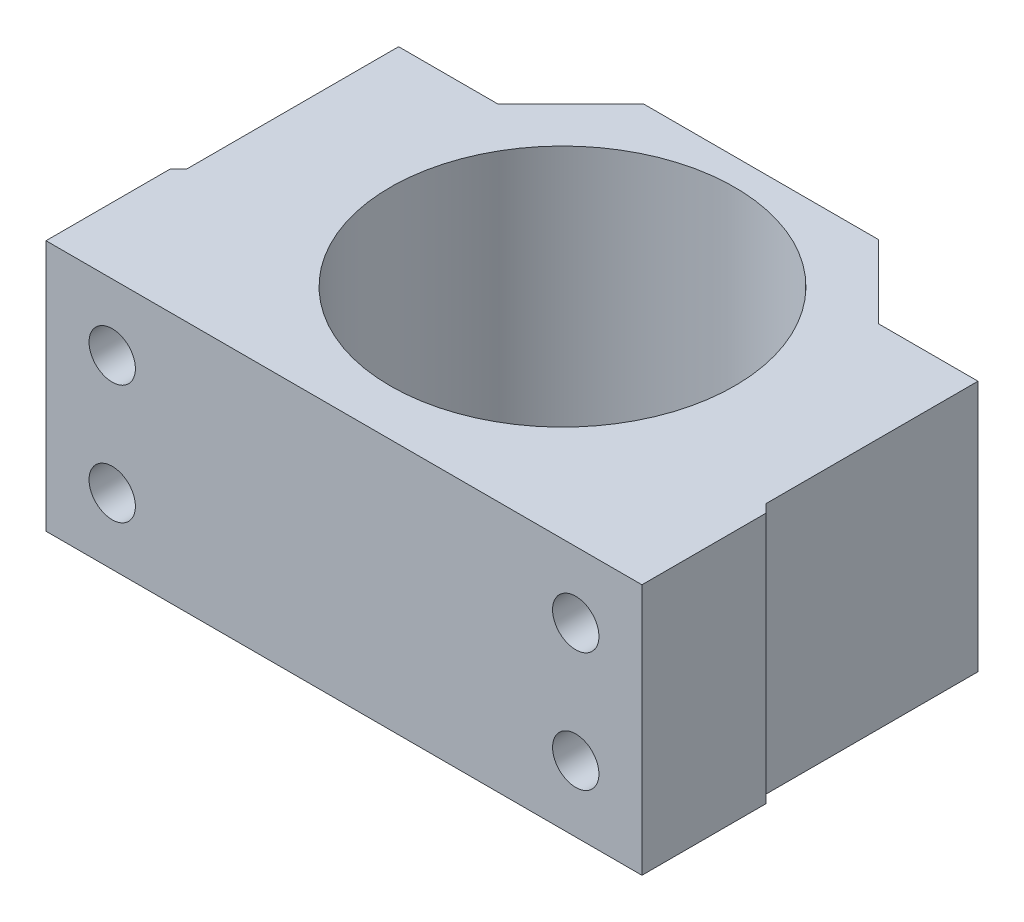
ISO-10303-21;
HEADER;
FILE_DESCRIPTION(('STEP AP214'),'2;1');
FILE_NAME('part.step','',(''),(''),'','','');
FILE_SCHEMA(('AUTOMOTIVE_DESIGN { 1 0 10303 214 1 1 1 1 }'));
ENDSEC;
DATA;
#1=APPLICATION_CONTEXT('core data for automotive mechanical design processes');
#2=APPLICATION_PROTOCOL_DEFINITION('international standard','automotive_design',2000,#1);
#3=PRODUCT_CONTEXT('',#1,'mechanical');
#4=PRODUCT('Part','Part','',(#3));
#5=PRODUCT_RELATED_PRODUCT_CATEGORY('part','',(#4));
#6=PRODUCT_DEFINITION_FORMATION('','',#4);
#7=PRODUCT_DEFINITION_CONTEXT('part definition',#1,'design');
#8=PRODUCT_DEFINITION('design','',#6,#7);
#9=PRODUCT_DEFINITION_SHAPE('','',#8);
#10=(LENGTH_UNIT() NAMED_UNIT(*) SI_UNIT(.MILLI.,.METRE.));
#11=(NAMED_UNIT(*) PLANE_ANGLE_UNIT() SI_UNIT($,.RADIAN.));
#12=(NAMED_UNIT(*) SI_UNIT($,.STERADIAN.) SOLID_ANGLE_UNIT());
#13=UNCERTAINTY_MEASURE_WITH_UNIT(LENGTH_MEASURE(1.E-05),#10,'distance_accuracy_value','');
#14=(GEOMETRIC_REPRESENTATION_CONTEXT(3) GLOBAL_UNCERTAINTY_ASSIGNED_CONTEXT((#13)) GLOBAL_UNIT_ASSIGNED_CONTEXT((#10,
#11,#12)) REPRESENTATION_CONTEXT('',''));
#15=CARTESIAN_POINT('',(0.,0.,0.));
#16=DIRECTION('',(0.,0.,1.));
#17=DIRECTION('',(1.,0.,0.));
#18=AXIS2_PLACEMENT_3D('',#15,#16,#17);
#19=CARTESIAN_POINT('',(90.,38.,0.));
#20=DIRECTION('',(1.,0.,0.));
#21=DIRECTION('',(0.,0.,-1.));
#22=AXIS2_PLACEMENT_3D('',#19,#20,#21);
#23=PLANE('',#22);
#24=DIRECTION('',(0.,0.,1.));
#25=VECTOR('',#24,1.);
#26=CARTESIAN_POINT('',(90.,0.,0.));
#27=LINE('',#26,#25);
#28=CARTESIAN_POINT('',(90.,0.,-18.75));
#29=VERTEX_POINT('',#28);
#30=CARTESIAN_POINT('',(90.,0.,0.));
#31=VERTEX_POINT('',#30);
#32=EDGE_CURVE('E184',#29,#31,#27,.T.);
#33=ORIENTED_EDGE('',*,*,#32,.F.);
#34=DIRECTION('',(0.,-1.,0.));
#35=VECTOR('',#34,1.);
#36=CARTESIAN_POINT('',(90.,38.,-18.75));
#37=LINE('',#36,#35);
#38=CARTESIAN_POINT('',(90.,38.,-18.75));
#39=VERTEX_POINT('',#38);
#40=EDGE_CURVE('E11',#39,#29,#37,.T.);
#41=ORIENTED_EDGE('',*,*,#40,.F.);
#42=DIRECTION('',(0.,0.,1.));
#43=VECTOR('',#42,1.);
#44=CARTESIAN_POINT('',(90.,38.,0.));
#45=LINE('',#44,#43);
#46=CARTESIAN_POINT('',(90.,38.,0.));
#47=VERTEX_POINT('',#46);
#48=EDGE_CURVE('E310',#39,#47,#45,.T.);
#49=ORIENTED_EDGE('',*,*,#48,.T.);
#50=DIRECTION('',(0.,-1.,0.));
#51=VECTOR('',#50,1.);
#52=CARTESIAN_POINT('',(90.,38.,0.));
#53=LINE('',#52,#51);
#54=EDGE_CURVE('E99',#47,#31,#53,.T.);
#55=ORIENTED_EDGE('',*,*,#54,.T.);
#56=EDGE_LOOP('',(#33,#41,#49,#55));
#57=FACE_BOUND('',#56,.T.);
#58=ADVANCED_FACE('F36',(#57),#23,.T.);
#59=CARTESIAN_POINT('',(54.3749999999993,38.,-54.3750000000002));
#60=DIRECTION('',(0.707106781186542,0.,-0.707106781186553));
#61=DIRECTION('',(-0.707106781186553,0.,-0.707106781186542));
#62=AXIS2_PLACEMENT_3D('',#59,#60,#61);
#63=PLANE('',#62);
#64=DIRECTION('',(0.707106781186553,0.,0.707106781186542));
#65=VECTOR('',#64,1.);
#66=CARTESIAN_POINT('',(54.3749999999993,0.,-54.3750000000002));
#67=LINE('',#66,#65);
#68=CARTESIAN_POINT('',(88.75,0.,-20.));
#69=VERTEX_POINT('',#68);
#70=EDGE_CURVE('E182',#69,#29,#67,.T.);
#71=ORIENTED_EDGE('',*,*,#70,.F.);
#72=DIRECTION('',(0.,-1.,0.));
#73=VECTOR('',#72,1.);
#74=CARTESIAN_POINT('',(88.75,38.,-20.));
#75=LINE('',#74,#73);
#76=CARTESIAN_POINT('',(88.75,38.,-20.));
#77=VERTEX_POINT('',#76);
#78=EDGE_CURVE('E45',#77,#69,#75,.T.);
#79=ORIENTED_EDGE('',*,*,#78,.F.);
#80=DIRECTION('',(0.707106781186553,0.,0.707106781186542));
#81=VECTOR('',#80,1.);
#82=CARTESIAN_POINT('',(54.3749999999993,38.,-54.3750000000002));
#83=LINE('',#82,#81);
#84=EDGE_CURVE('E312',#77,#39,#83,.T.);
#85=ORIENTED_EDGE('',*,*,#84,.T.);
#86=ORIENTED_EDGE('',*,*,#40,.T.);
#87=EDGE_LOOP('',(#71,#79,#85,#86));
#88=FACE_BOUND('',#87,.T.);
#89=ADVANCED_FACE('F183',(#88),#63,.T.);
#90=CARTESIAN_POINT('',(88.75,38.,0.));
#91=DIRECTION('',(1.,0.,0.));
#92=DIRECTION('',(0.,0.,-1.));
#93=AXIS2_PLACEMENT_3D('',#90,#91,#92);
#94=PLANE('',#93);
#95=DIRECTION('',(0.,0.,1.));
#96=VECTOR('',#95,1.);
#97=CARTESIAN_POINT('',(88.75,0.,0.));
#98=LINE('',#97,#96);
#99=CARTESIAN_POINT('',(88.75,0.,-52.));
#100=VERTEX_POINT('',#99);
#101=EDGE_CURVE('E175',#100,#69,#98,.T.);
#102=ORIENTED_EDGE('',*,*,#101,.F.);
#103=DIRECTION('',(0.,-1.,0.));
#104=VECTOR('',#103,1.);
#105=CARTESIAN_POINT('',(88.75,38.,-52.));
#106=LINE('',#105,#104);
#107=CARTESIAN_POINT('',(88.75,38.,-52.));
#108=VERTEX_POINT('',#107);
#109=EDGE_CURVE('E168',#108,#100,#106,.T.);
#110=ORIENTED_EDGE('',*,*,#109,.F.);
#111=DIRECTION('',(0.,0.,1.));
#112=VECTOR('',#111,1.);
#113=CARTESIAN_POINT('',(88.75,38.,0.));
#114=LINE('',#113,#112);
#115=EDGE_CURVE('E177',#108,#77,#114,.T.);
#116=ORIENTED_EDGE('',*,*,#115,.T.);
#117=ORIENTED_EDGE('',*,*,#78,.T.);
#118=EDGE_LOOP('',(#102,#110,#116,#117));
#119=FACE_BOUND('',#118,.T.);
#120=ADVANCED_FACE('F173',(#119),#94,.T.);
#121=CARTESIAN_POINT('',(5.77315972805093E-13,38.,-52.000000000001));
#122=DIRECTION('',(0.,0.,1.));
#123=DIRECTION('',(1.,0.,0.));
#124=AXIS2_PLACEMENT_3D('',#121,#122,#123);
#125=PLANE('',#124);
#126=CARTESIAN_POINT('',(80.,10.,-52.0000000000001));
#127=DIRECTION('',(0.,0.,1.));
#128=DIRECTION('',(1.,0.,0.));
#129=AXIS2_PLACEMENT_3D('',#126,#127,#128);
#130=CIRCLE('',#129,3.50000000000001);
#131=CARTESIAN_POINT('',(83.5,10.,-52.));
#132=VERTEX_POINT('',#131);
#133=EDGE_CURVE('E287',#132,#132,#130,.T.);
#134=ORIENTED_EDGE('',*,*,#133,.T.);
#135=EDGE_LOOP('',(#134));
#136=FACE_BOUND('',#135,.T.);
#137=CARTESIAN_POINT('',(80.,28.,-52.0000000000001));
#138=DIRECTION('',(0.,0.,1.));
#139=DIRECTION('',(1.,0.,0.));
#140=AXIS2_PLACEMENT_3D('',#137,#138,#139);
#141=CIRCLE('',#140,3.50000000000001);
#142=CARTESIAN_POINT('',(83.5,28.,-52.));
#143=VERTEX_POINT('',#142);
#144=EDGE_CURVE('E291',#143,#143,#141,.T.);
#145=ORIENTED_EDGE('',*,*,#144,.T.);
#146=EDGE_LOOP('',(#145));
#147=FACE_BOUND('',#146,.T.);
#148=DIRECTION('',(-1.,0.,0.));
#149=VECTOR('',#148,1.);
#150=CARTESIAN_POINT('',(5.77315972805093E-13,0.,-52.000000000001));
#151=LINE('',#150,#149);
#152=CARTESIAN_POINT('',(73.75,0.,-52.0000000000002));
#153=VERTEX_POINT('',#152);
#154=EDGE_CURVE('E189',#100,#153,#151,.T.);
#155=ORIENTED_EDGE('',*,*,#154,.T.);
#156=DIRECTION('',(0.,-1.,0.));
#157=VECTOR('',#156,1.);
#158=CARTESIAN_POINT('',(73.75,38.,-52.0000000000002));
#159=LINE('',#158,#157);
#160=CARTESIAN_POINT('',(73.75,38.,-52.0000000000002));
#161=VERTEX_POINT('',#160);
#162=EDGE_CURVE('E165',#161,#153,#159,.T.);
#163=ORIENTED_EDGE('',*,*,#162,.F.);
#164=DIRECTION('',(-1.,0.,0.));
#165=VECTOR('',#164,1.);
#166=CARTESIAN_POINT('',(5.77315972805093E-13,38.,-52.000000000001));
#167=LINE('',#166,#165);
#168=EDGE_CURVE('E315',#108,#161,#167,.T.);
#169=ORIENTED_EDGE('',*,*,#168,.F.);
#170=ORIENTED_EDGE('',*,*,#109,.T.);
#171=EDGE_LOOP('',(#155,#163,#169,#170));
#172=FACE_BOUND('',#171,.T.);
#173=ADVANCED_FACE('F226',(#136,#147,#172),#125,.F.);
#174=CARTESIAN_POINT('',(62.874999999999,38.,-62.8750000000008));
#175=DIRECTION('',(-0.707106781186537,0.,0.707106781186558));
#176=DIRECTION('',(0.707106781186558,0.,0.707106781186537));
#177=AXIS2_PLACEMENT_3D('',#174,#175,#176);
#178=PLANE('',#177);
#179=DIRECTION('',(-0.707106781186558,0.,-0.707106781186537));
#180=VECTOR('',#179,1.);
#181=CARTESIAN_POINT('',(62.874999999999,0.,-62.8750000000008));
#182=LINE('',#181,#180);
#183=CARTESIAN_POINT('',(62.7399999999999,0.,-63.01));
#184=VERTEX_POINT('',#183);
#185=EDGE_CURVE('E191',#153,#184,#182,.T.);
#186=ORIENTED_EDGE('',*,*,#185,.T.);
#187=DIRECTION('',(0.,-1.,0.));
#188=VECTOR('',#187,1.);
#189=CARTESIAN_POINT('',(62.7399999999999,38.,-63.01));
#190=LINE('',#189,#188);
#191=CARTESIAN_POINT('',(62.7399999999999,38.,-63.01));
#192=VERTEX_POINT('',#191);
#193=EDGE_CURVE('E163',#192,#184,#190,.T.);
#194=ORIENTED_EDGE('',*,*,#193,.F.);
#195=DIRECTION('',(-0.707106781186558,0.,-0.707106781186537));
#196=VECTOR('',#195,1.);
#197=CARTESIAN_POINT('',(62.874999999999,38.,-62.8750000000008));
#198=LINE('',#197,#196);
#199=EDGE_CURVE('E318',#161,#192,#198,.T.);
#200=ORIENTED_EDGE('',*,*,#199,.F.);
#201=ORIENTED_EDGE('',*,*,#162,.T.);
#202=EDGE_LOOP('',(#186,#194,#200,#201));
#203=FACE_BOUND('',#202,.T.);
#204=ADVANCED_FACE('F229',(#203),#178,.F.);
#205=CARTESIAN_POINT('',(0.,38.,-63.01));
#206=DIRECTION('',(0.,0.,-1.));
#207=DIRECTION('',(-1.,0.,0.));
#208=AXIS2_PLACEMENT_3D('',#205,#206,#207);
#209=PLANE('',#208);
#210=DIRECTION('',(1.,0.,0.));
#211=VECTOR('',#210,1.);
#212=CARTESIAN_POINT('',(0.,0.,-63.01));
#213=LINE('',#212,#211);
#214=CARTESIAN_POINT('',(27.2599999999997,0.,-63.01));
#215=VERTEX_POINT('',#214);
#216=EDGE_CURVE('E197',#215,#184,#213,.T.);
#217=ORIENTED_EDGE('',*,*,#216,.F.);
#218=DIRECTION('',(0.,-1.,0.));
#219=VECTOR('',#218,1.);
#220=CARTESIAN_POINT('',(27.2599999999997,38.,-63.01));
#221=LINE('',#220,#219);
#222=CARTESIAN_POINT('',(27.2599999999997,38.,-63.01));
#223=VERTEX_POINT('',#222);
#224=EDGE_CURVE('E161',#223,#215,#221,.T.);
#225=ORIENTED_EDGE('',*,*,#224,.F.);
#226=DIRECTION('',(1.,0.,0.));
#227=VECTOR('',#226,1.);
#228=CARTESIAN_POINT('',(0.,38.,-63.01));
#229=LINE('',#228,#227);
#230=EDGE_CURVE('E320',#223,#192,#229,.T.);
#231=ORIENTED_EDGE('',*,*,#230,.T.);
#232=ORIENTED_EDGE('',*,*,#193,.T.);
#233=EDGE_LOOP('',(#217,#225,#231,#232));
#234=FACE_BOUND('',#233,.T.);
#235=ADVANCED_FACE('F233',(#234),#209,.T.);
#236=CARTESIAN_POINT('',(-17.8749999999998,38.,-17.8749999999992));
#237=DIRECTION('',(-0.707106781186558,0.,-0.707106781186537));
#238=DIRECTION('',(-0.707106781186537,0.,0.707106781186558));
#239=AXIS2_PLACEMENT_3D('',#236,#237,#238);
#240=PLANE('',#239);
#241=DIRECTION('',(0.707106781186537,0.,-0.707106781186558));
#242=VECTOR('',#241,1.);
#243=CARTESIAN_POINT('',(-17.8749999999998,0.,-17.8749999999992));
#244=LINE('',#243,#242);
#245=CARTESIAN_POINT('',(16.25,0.,-52.));
#246=VERTEX_POINT('',#245);
#247=EDGE_CURVE('E200',#246,#215,#244,.T.);
#248=ORIENTED_EDGE('',*,*,#247,.F.);
#249=DIRECTION('',(0.,-1.,0.));
#250=VECTOR('',#249,1.);
#251=CARTESIAN_POINT('',(16.25,38.,-52.));
#252=LINE('',#251,#250);
#253=CARTESIAN_POINT('',(16.25,38.,-52.));
#254=VERTEX_POINT('',#253);
#255=EDGE_CURVE('E159',#254,#246,#252,.T.);
#256=ORIENTED_EDGE('',*,*,#255,.F.);
#257=DIRECTION('',(0.707106781186537,0.,-0.707106781186558));
#258=VECTOR('',#257,1.);
#259=CARTESIAN_POINT('',(-17.8749999999998,38.,-17.8749999999992));
#260=LINE('',#259,#258);
#261=EDGE_CURVE('E323',#254,#223,#260,.T.);
#262=ORIENTED_EDGE('',*,*,#261,.T.);
#263=ORIENTED_EDGE('',*,*,#224,.T.);
#264=EDGE_LOOP('',(#248,#256,#262,#263));
#265=FACE_BOUND('',#264,.T.);
#266=ADVANCED_FACE('F237',(#265),#240,.T.);
#267=CARTESIAN_POINT('',(0.,38.,-52.));
#268=DIRECTION('',(0.,0.,-1.));
#269=DIRECTION('',(-1.,0.,0.));
#270=AXIS2_PLACEMENT_3D('',#267,#268,#269);
#271=PLANE('',#270);
#272=CARTESIAN_POINT('',(10.,10.,-52.));
#273=DIRECTION('',(0.,0.,-1.));
#274=DIRECTION('',(-1.,0.,0.));
#275=AXIS2_PLACEMENT_3D('',#272,#273,#274);
#276=CIRCLE('',#275,3.5);
#277=CARTESIAN_POINT('',(6.5,10.,-52.));
#278=VERTEX_POINT('',#277);
#279=EDGE_CURVE('E300',#278,#278,#276,.T.);
#280=ORIENTED_EDGE('',*,*,#279,.F.);
#281=EDGE_LOOP('',(#280));
#282=FACE_BOUND('',#281,.T.);
#283=CARTESIAN_POINT('',(10.,28.,-52.));
#284=DIRECTION('',(0.,0.,-1.));
#285=DIRECTION('',(-1.,0.,0.));
#286=AXIS2_PLACEMENT_3D('',#283,#284,#285);
#287=CIRCLE('',#286,3.5);
#288=CARTESIAN_POINT('',(6.5,28.,-52.));
#289=VERTEX_POINT('',#288);
#290=EDGE_CURVE('E217',#289,#289,#287,.T.);
#291=ORIENTED_EDGE('',*,*,#290,.F.);
#292=EDGE_LOOP('',(#291));
#293=FACE_BOUND('',#292,.T.);
#294=DIRECTION('',(1.,0.,0.));
#295=VECTOR('',#294,1.);
#296=CARTESIAN_POINT('',(0.,0.,-52.));
#297=LINE('',#296,#295);
#298=CARTESIAN_POINT('',(1.25,0.,-52.));
#299=VERTEX_POINT('',#298);
#300=EDGE_CURVE('E203',#299,#246,#297,.T.);
#301=ORIENTED_EDGE('',*,*,#300,.F.);
#302=DIRECTION('',(0.,-1.,0.));
#303=VECTOR('',#302,1.);
#304=CARTESIAN_POINT('',(1.25,38.,-52.));
#305=LINE('',#304,#303);
#306=CARTESIAN_POINT('',(1.25,38.,-52.));
#307=VERTEX_POINT('',#306);
#308=EDGE_CURVE('E153',#307,#299,#305,.T.);
#309=ORIENTED_EDGE('',*,*,#308,.F.);
#310=DIRECTION('',(1.,0.,0.));
#311=VECTOR('',#310,1.);
#312=CARTESIAN_POINT('',(0.,38.,-52.));
#313=LINE('',#312,#311);
#314=EDGE_CURVE('E326',#307,#254,#313,.T.);
#315=ORIENTED_EDGE('',*,*,#314,.T.);
#316=ORIENTED_EDGE('',*,*,#255,.T.);
#317=EDGE_LOOP('',(#301,#309,#315,#316));
#318=FACE_BOUND('',#317,.T.);
#319=ADVANCED_FACE('F241',(#282,#293,#318),#271,.T.);
#320=CARTESIAN_POINT('',(1.25,38.,0.));
#321=DIRECTION('',(1.,0.,0.));
#322=DIRECTION('',(0.,0.,-1.));
#323=AXIS2_PLACEMENT_3D('',#320,#321,#322);
#324=PLANE('',#323);
#325=DIRECTION('',(0.,0.,1.));
#326=VECTOR('',#325,1.);
#327=CARTESIAN_POINT('',(1.25,0.,0.));
#328=LINE('',#327,#326);
#329=CARTESIAN_POINT('',(1.25,0.,-20.));
#330=VERTEX_POINT('',#329);
#331=EDGE_CURVE('E206',#299,#330,#328,.T.);
#332=ORIENTED_EDGE('',*,*,#331,.T.);
#333=DIRECTION('',(0.,-1.,0.));
#334=VECTOR('',#333,1.);
#335=CARTESIAN_POINT('',(1.25,38.,-20.));
#336=LINE('',#335,#334);
#337=CARTESIAN_POINT('',(1.25,38.,-20.));
#338=VERTEX_POINT('',#337);
#339=EDGE_CURVE('E151',#338,#330,#336,.T.);
#340=ORIENTED_EDGE('',*,*,#339,.F.);
#341=DIRECTION('',(0.,0.,1.));
#342=VECTOR('',#341,1.);
#343=CARTESIAN_POINT('',(1.25,38.,0.));
#344=LINE('',#343,#342);
#345=EDGE_CURVE('E144',#307,#338,#344,.T.);
#346=ORIENTED_EDGE('',*,*,#345,.F.);
#347=ORIENTED_EDGE('',*,*,#308,.T.);
#348=EDGE_LOOP('',(#332,#340,#346,#347));
#349=FACE_BOUND('',#348,.T.);
#350=ADVANCED_FACE('F245',(#349),#324,.F.);
#351=CARTESIAN_POINT('',(-9.37499999999999,38.,-9.37499999999989));
#352=DIRECTION('',(0.707106781186552,0.,0.707106781186544));
#353=DIRECTION('',(0.707106781186544,0.,-0.707106781186552));
#354=AXIS2_PLACEMENT_3D('',#351,#352,#353);
#355=PLANE('',#354);
#356=DIRECTION('',(-0.707106781186544,0.,0.707106781186552));
#357=VECTOR('',#356,1.);
#358=CARTESIAN_POINT('',(-9.37499999999999,0.,-9.37499999999989));
#359=LINE('',#358,#357);
#360=CARTESIAN_POINT('',(0.,0.,-18.75));
#361=VERTEX_POINT('',#360);
#362=EDGE_CURVE('E150',#330,#361,#359,.T.);
#363=ORIENTED_EDGE('',*,*,#362,.T.);
#364=DIRECTION('',(0.,-1.,0.));
#365=VECTOR('',#364,1.);
#366=CARTESIAN_POINT('',(0.,38.,-18.75));
#367=LINE('',#366,#365);
#368=CARTESIAN_POINT('',(0.,38.,-18.75));
#369=VERTEX_POINT('',#368);
#370=EDGE_CURVE('E135',#369,#361,#367,.T.);
#371=ORIENTED_EDGE('',*,*,#370,.F.);
#372=DIRECTION('',(-0.707106781186544,0.,0.707106781186552));
#373=VECTOR('',#372,1.);
#374=CARTESIAN_POINT('',(-9.37499999999999,38.,-9.37499999999989));
#375=LINE('',#374,#373);
#376=EDGE_CURVE('E138',#338,#369,#375,.T.);
#377=ORIENTED_EDGE('',*,*,#376,.F.);
#378=ORIENTED_EDGE('',*,*,#339,.T.);
#379=EDGE_LOOP('',(#363,#371,#377,#378));
#380=FACE_BOUND('',#379,.T.);
#381=ADVANCED_FACE('F149',(#380),#355,.F.);
#382=CARTESIAN_POINT('',(0.,38.,0.));
#383=DIRECTION('',(1.,0.,0.));
#384=DIRECTION('',(0.,0.,-1.));
#385=AXIS2_PLACEMENT_3D('',#382,#383,#384);
#386=PLANE('',#385);
#387=DIRECTION('',(0.,0.,1.));
#388=VECTOR('',#387,1.);
#389=CARTESIAN_POINT('',(0.,0.,0.));
#390=LINE('',#389,#388);
#391=CARTESIAN_POINT('',(0.,0.,0.));
#392=VERTEX_POINT('',#391);
#393=EDGE_CURVE('E210',#361,#392,#390,.T.);
#394=ORIENTED_EDGE('',*,*,#393,.T.);
#395=DIRECTION('',(0.,-1.,0.));
#396=VECTOR('',#395,1.);
#397=CARTESIAN_POINT('',(0.,38.,0.));
#398=LINE('',#397,#396);
#399=CARTESIAN_POINT('',(0.,38.,0.));
#400=VERTEX_POINT('',#399);
#401=EDGE_CURVE('E137',#400,#392,#398,.T.);
#402=ORIENTED_EDGE('',*,*,#401,.F.);
#403=DIRECTION('',(0.,0.,1.));
#404=VECTOR('',#403,1.);
#405=CARTESIAN_POINT('',(0.,38.,0.));
#406=LINE('',#405,#404);
#407=EDGE_CURVE('E130',#369,#400,#406,.T.);
#408=ORIENTED_EDGE('',*,*,#407,.F.);
#409=ORIENTED_EDGE('',*,*,#370,.T.);
#410=EDGE_LOOP('',(#394,#402,#408,#409));
#411=FACE_BOUND('',#410,.T.);
#412=ADVANCED_FACE('F133',(#411),#386,.F.);
#413=CARTESIAN_POINT('',(45.,38.,-33.));
#414=DIRECTION('',(0.,-1.,0.));
#415=DIRECTION('',(0.,0.,-1.));
#416=AXIS2_PLACEMENT_3D('',#413,#414,#415);
#417=CYLINDRICAL_SURFACE('',#416,26.);
#418=CARTESIAN_POINT('',(45.,38.,-33.));
#419=DIRECTION('',(0.,1.,0.));
#420=DIRECTION('',(0.,0.,1.));
#421=AXIS2_PLACEMENT_3D('',#418,#419,#420);
#422=CIRCLE('',#421,26.);
#423=CARTESIAN_POINT('',(45.,38.,-7.00000000000001));
#424=VERTEX_POINT('',#423);
#425=EDGE_CURVE('E212',#424,#424,#422,.T.);
#426=ORIENTED_EDGE('',*,*,#425,.T.);
#427=EDGE_LOOP('',(#426));
#428=FACE_BOUND('',#427,.T.);
#429=CARTESIAN_POINT('',(45.,0.,-33.));
#430=DIRECTION('',(0.,1.,0.));
#431=DIRECTION('',(0.,0.,1.));
#432=AXIS2_PLACEMENT_3D('',#429,#430,#431);
#433=CIRCLE('',#432,26.);
#434=CARTESIAN_POINT('',(45.,0.,-7.00000000000001));
#435=VERTEX_POINT('',#434);
#436=EDGE_CURVE('E215',#435,#435,#433,.T.);
#437=ORIENTED_EDGE('',*,*,#436,.F.);
#438=EDGE_LOOP('',(#437));
#439=FACE_BOUND('',#438,.T.);
#440=ADVANCED_FACE('F38',(#428,#439),#417,.F.);
#441=CARTESIAN_POINT('',(0.,38.,0.));
#442=DIRECTION('',(0.,0.,-1.));
#443=DIRECTION('',(-1.,0.,0.));
#444=AXIS2_PLACEMENT_3D('',#441,#442,#443);
#445=PLANE('',#444);
#446=CARTESIAN_POINT('',(80.,10.,0.));
#447=DIRECTION('',(0.,0.,1.));
#448=DIRECTION('',(1.,0.,0.));
#449=AXIS2_PLACEMENT_3D('',#446,#447,#448);
#450=CIRCLE('',#449,3.50000000000001);
#451=CARTESIAN_POINT('',(83.5,10.,0.));
#452=VERTEX_POINT('',#451);
#453=EDGE_CURVE('E284',#452,#452,#450,.T.);
#454=ORIENTED_EDGE('',*,*,#453,.F.);
#455=EDGE_LOOP('',(#454));
#456=FACE_BOUND('',#455,.T.);
#457=CARTESIAN_POINT('',(80.,28.,0.));
#458=DIRECTION('',(0.,0.,1.));
#459=DIRECTION('',(1.,0.,0.));
#460=AXIS2_PLACEMENT_3D('',#457,#458,#459);
#461=CIRCLE('',#460,3.50000000000001);
#462=CARTESIAN_POINT('',(83.5,28.,0.));
#463=VERTEX_POINT('',#462);
#464=EDGE_CURVE('E288',#463,#463,#461,.T.);
#465=ORIENTED_EDGE('',*,*,#464,.F.);
#466=EDGE_LOOP('',(#465));
#467=FACE_BOUND('',#466,.T.);
#468=CARTESIAN_POINT('',(10.,10.,0.));
#469=DIRECTION('',(0.,0.,1.));
#470=DIRECTION('',(1.,0.,0.));
#471=AXIS2_PLACEMENT_3D('',#468,#469,#470);
#472=CIRCLE('',#471,3.5);
#473=CARTESIAN_POINT('',(13.5,10.,0.));
#474=VERTEX_POINT('',#473);
#475=EDGE_CURVE('E297',#474,#474,#472,.T.);
#476=ORIENTED_EDGE('',*,*,#475,.F.);
#477=EDGE_LOOP('',(#476));
#478=FACE_BOUND('',#477,.T.);
#479=CARTESIAN_POINT('',(10.,28.,0.));
#480=DIRECTION('',(0.,0.,1.));
#481=DIRECTION('',(1.,0.,0.));
#482=AXIS2_PLACEMENT_3D('',#479,#480,#481);
#483=CIRCLE('',#482,3.5);
#484=CARTESIAN_POINT('',(13.5,28.,0.));
#485=VERTEX_POINT('',#484);
#486=EDGE_CURVE('E303',#485,#485,#483,.T.);
#487=ORIENTED_EDGE('',*,*,#486,.F.);
#488=EDGE_LOOP('',(#487));
#489=FACE_BOUND('',#488,.T.);
#490=DIRECTION('',(1.,0.,0.));
#491=VECTOR('',#490,1.);
#492=CARTESIAN_POINT('',(0.,0.,0.));
#493=LINE('',#492,#491);
#494=EDGE_CURVE('E92',#392,#31,#493,.T.);
#495=ORIENTED_EDGE('',*,*,#494,.T.);
#496=ORIENTED_EDGE('',*,*,#54,.F.);
#497=DIRECTION('',(1.,0.,0.));
#498=VECTOR('',#497,1.);
#499=CARTESIAN_POINT('',(0.,38.,0.));
#500=LINE('',#499,#498);
#501=EDGE_CURVE('E53',#400,#47,#500,.T.);
#502=ORIENTED_EDGE('',*,*,#501,.F.);
#503=ORIENTED_EDGE('',*,*,#401,.T.);
#504=EDGE_LOOP('',(#495,#496,#502,#503));
#505=FACE_BOUND('',#504,.T.);
#506=ADVANCED_FACE('F254',(#456,#467,#478,#489,#505),#445,.F.);
#507=CARTESIAN_POINT('',(0.,38.,0.));
#508=DIRECTION('',(0.,1.,0.));
#509=DIRECTION('',(0.,0.,1.));
#510=AXIS2_PLACEMENT_3D('',#507,#508,#509);
#511=PLANE('',#510);
#512=ORIENTED_EDGE('',*,*,#425,.F.);
#513=EDGE_LOOP('',(#512));
#514=FACE_BOUND('',#513,.T.);
#515=ORIENTED_EDGE('',*,*,#48,.F.);
#516=ORIENTED_EDGE('',*,*,#84,.F.);
#517=ORIENTED_EDGE('',*,*,#115,.F.);
#518=ORIENTED_EDGE('',*,*,#168,.T.);
#519=ORIENTED_EDGE('',*,*,#199,.T.);
#520=ORIENTED_EDGE('',*,*,#230,.F.);
#521=ORIENTED_EDGE('',*,*,#261,.F.);
#522=ORIENTED_EDGE('',*,*,#314,.F.);
#523=ORIENTED_EDGE('',*,*,#345,.T.);
#524=ORIENTED_EDGE('',*,*,#376,.T.);
#525=ORIENTED_EDGE('',*,*,#407,.T.);
#526=ORIENTED_EDGE('',*,*,#501,.T.);
#527=EDGE_LOOP('',(#515,#516,#517,#518,#519,#520,#521,#522,#523,#524,#525,#526));
#528=FACE_BOUND('',#527,.T.);
#529=ADVANCED_FACE('F141',(#514,#528),#511,.T.);
#530=CARTESIAN_POINT('',(0.,0.,0.));
#531=DIRECTION('',(0.,1.,0.));
#532=DIRECTION('',(0.,0.,1.));
#533=AXIS2_PLACEMENT_3D('',#530,#531,#532);
#534=PLANE('',#533);
#535=ORIENTED_EDGE('',*,*,#436,.T.);
#536=EDGE_LOOP('',(#535));
#537=FACE_BOUND('',#536,.T.);
#538=ORIENTED_EDGE('',*,*,#32,.T.);
#539=ORIENTED_EDGE('',*,*,#494,.F.);
#540=ORIENTED_EDGE('',*,*,#393,.F.);
#541=ORIENTED_EDGE('',*,*,#362,.F.);
#542=ORIENTED_EDGE('',*,*,#331,.F.);
#543=ORIENTED_EDGE('',*,*,#300,.T.);
#544=ORIENTED_EDGE('',*,*,#247,.T.);
#545=ORIENTED_EDGE('',*,*,#216,.T.);
#546=ORIENTED_EDGE('',*,*,#185,.F.);
#547=ORIENTED_EDGE('',*,*,#154,.F.);
#548=ORIENTED_EDGE('',*,*,#101,.T.);
#549=ORIENTED_EDGE('',*,*,#70,.T.);
#550=EDGE_LOOP('',(#538,#539,#540,#541,#542,#543,#544,#545,#546,#547,#548,#549));
#551=FACE_BOUND('',#550,.T.);
#552=ADVANCED_FACE('F187',(#537,#551),#534,.F.);
#553=CARTESIAN_POINT('',(10.,28.,-63.01));
#554=DIRECTION('',(0.,0.,1.));
#555=DIRECTION('',(1.,0.,0.));
#556=AXIS2_PLACEMENT_3D('',#553,#554,#555);
#557=CYLINDRICAL_SURFACE('',#556,3.5);
#558=ORIENTED_EDGE('',*,*,#290,.T.);
#559=EDGE_LOOP('',(#558));
#560=FACE_BOUND('',#559,.T.);
#561=ORIENTED_EDGE('',*,*,#486,.T.);
#562=EDGE_LOOP('',(#561));
#563=FACE_BOUND('',#562,.T.);
#564=ADVANCED_FACE('F260',(#560,#563),#557,.F.);
#565=CARTESIAN_POINT('',(10.,10.,-63.01));
#566=DIRECTION('',(0.,0.,1.));
#567=DIRECTION('',(1.,0.,0.));
#568=AXIS2_PLACEMENT_3D('',#565,#566,#567);
#569=CYLINDRICAL_SURFACE('',#568,3.5);
#570=ORIENTED_EDGE('',*,*,#279,.T.);
#571=EDGE_LOOP('',(#570));
#572=FACE_BOUND('',#571,.T.);
#573=ORIENTED_EDGE('',*,*,#475,.T.);
#574=EDGE_LOOP('',(#573));
#575=FACE_BOUND('',#574,.T.);
#576=ADVANCED_FACE('F267',(#572,#575),#569,.F.);
#577=CARTESIAN_POINT('',(80.,28.,-63.01));
#578=DIRECTION('',(0.,0.,1.));
#579=DIRECTION('',(1.,0.,0.));
#580=AXIS2_PLACEMENT_3D('',#577,#578,#579);
#581=CYLINDRICAL_SURFACE('',#580,3.50000000000001);
#582=ORIENTED_EDGE('',*,*,#464,.T.);
#583=EDGE_LOOP('',(#582));
#584=FACE_BOUND('',#583,.T.);
#585=ORIENTED_EDGE('',*,*,#144,.F.);
#586=EDGE_LOOP('',(#585));
#587=FACE_BOUND('',#586,.T.);
#588=ADVANCED_FACE('F271',(#584,#587),#581,.F.);
#589=CARTESIAN_POINT('',(80.,10.,-63.01));
#590=DIRECTION('',(0.,0.,1.));
#591=DIRECTION('',(1.,0.,0.));
#592=AXIS2_PLACEMENT_3D('',#589,#590,#591);
#593=CYLINDRICAL_SURFACE('',#592,3.50000000000001);
#594=ORIENTED_EDGE('',*,*,#453,.T.);
#595=EDGE_LOOP('',(#594));
#596=FACE_BOUND('',#595,.T.);
#597=ORIENTED_EDGE('',*,*,#133,.F.);
#598=EDGE_LOOP('',(#597));
#599=FACE_BOUND('',#598,.T.);
#600=ADVANCED_FACE('F275',(#596,#599),#593,.F.);
#601=CLOSED_SHELL('',(#58,#89,#120,#173,#204,#235,#266,#319,#350,#381,#412,#440,#506,#529,#552,
#564,#576,#588,#600));
#602=MANIFOLD_SOLID_BREP('B2',#601);
#603=ADVANCED_BREP_SHAPE_REPRESENTATION('',(#18,#602),#14);
#604=SHAPE_DEFINITION_REPRESENTATION(#9,#603);
ENDSEC;
END-ISO-10303-21;
